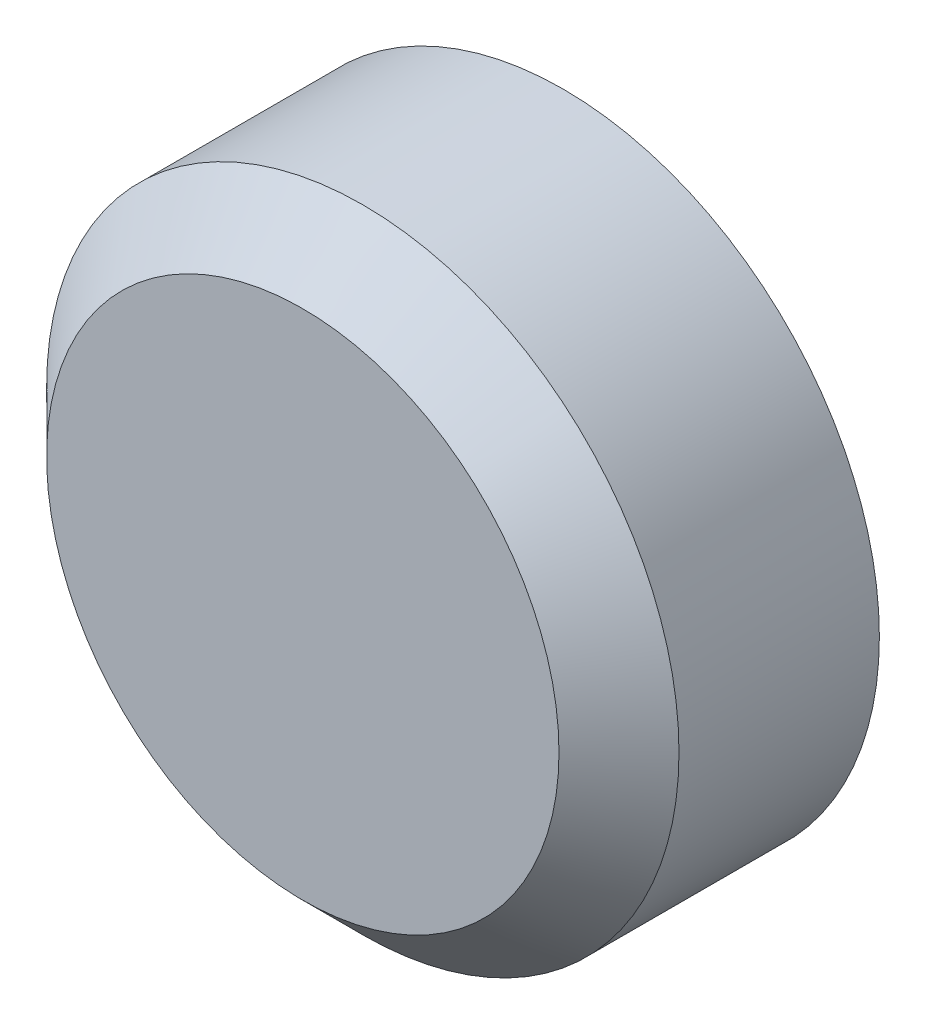
ISO-10303-21;
HEADER;
FILE_DESCRIPTION(('STEP AP214'),'2;1');
FILE_NAME('part.step','',(''),(''),'','','');
FILE_SCHEMA(('AUTOMOTIVE_DESIGN { 1 0 10303 214 1 1 1 1 }'));
ENDSEC;
DATA;
#1=APPLICATION_CONTEXT('core data for automotive mechanical design processes');
#2=APPLICATION_PROTOCOL_DEFINITION('international standard','automotive_design',2000,#1);
#3=PRODUCT_CONTEXT('',#1,'mechanical');
#4=PRODUCT('Part','Part','',(#3));
#5=PRODUCT_RELATED_PRODUCT_CATEGORY('part','',(#4));
#6=PRODUCT_DEFINITION_FORMATION('','',#4);
#7=PRODUCT_DEFINITION_CONTEXT('part definition',#1,'design');
#8=PRODUCT_DEFINITION('design','',#6,#7);
#9=PRODUCT_DEFINITION_SHAPE('','',#8);
#10=(LENGTH_UNIT() NAMED_UNIT(*) SI_UNIT(.MILLI.,.METRE.));
#11=(NAMED_UNIT(*) PLANE_ANGLE_UNIT() SI_UNIT($,.RADIAN.));
#12=(NAMED_UNIT(*) SI_UNIT($,.STERADIAN.) SOLID_ANGLE_UNIT());
#13=UNCERTAINTY_MEASURE_WITH_UNIT(LENGTH_MEASURE(1.E-05),#10,'distance_accuracy_value','');
#14=(GEOMETRIC_REPRESENTATION_CONTEXT(3) GLOBAL_UNCERTAINTY_ASSIGNED_CONTEXT((#13)) GLOBAL_UNIT_ASSIGNED_CONTEXT((#10,
#11,#12)) REPRESENTATION_CONTEXT('',''));
#15=CARTESIAN_POINT('',(0.,0.,0.));
#16=DIRECTION('',(0.,0.,1.));
#17=DIRECTION('',(1.,0.,0.));
#18=AXIS2_PLACEMENT_3D('',#15,#16,#17);
#19=CARTESIAN_POINT('',(0.,0.,9.62290547370621));
#20=DIRECTION('',(0.,0.,-1.));
#21=DIRECTION('',(-1.,0.,0.));
#22=AXIS2_PLACEMENT_3D('',#19,#20,#21);
#23=CYLINDRICAL_SURFACE('',#22,2.635);
#24=CARTESIAN_POINT('',(0.,0.,1.67));
#25=DIRECTION('',(0.,0.,1.));
#26=DIRECTION('',(1.,0.,0.));
#27=AXIS2_PLACEMENT_3D('',#24,#25,#26);
#28=CIRCLE('',#27,2.635);
#29=CARTESIAN_POINT('',(2.635,0.,1.67));
#30=VERTEX_POINT('',#29);
#31=EDGE_CURVE('E10',#30,#30,#28,.F.);
#32=ORIENTED_EDGE('',*,*,#31,.T.);
#33=EDGE_LOOP('',(#32));
#34=FACE_BOUND('',#33,.T.);
#35=CARTESIAN_POINT('',(0.,0.,0.));
#36=DIRECTION('',(0.,0.,1.));
#37=DIRECTION('',(1.,0.,0.));
#38=AXIS2_PLACEMENT_3D('',#35,#36,#37);
#39=CIRCLE('',#38,2.635);
#40=CARTESIAN_POINT('',(2.635,0.,0.));
#41=VERTEX_POINT('',#40);
#42=EDGE_CURVE('E41',#41,#41,#39,.T.);
#43=ORIENTED_EDGE('',*,*,#42,.T.);
#44=EDGE_LOOP('',(#43));
#45=FACE_BOUND('',#44,.T.);
#46=ADVANCED_FACE('F30',(#34,#45),#23,.T.);
#47=CARTESIAN_POINT('',(0.,0.,0.));
#48=DIRECTION('',(0.,0.,1.));
#49=DIRECTION('',(1.,0.,0.));
#50=AXIS2_PLACEMENT_3D('',#47,#48,#49);
#51=PLANE('',#50);
#52=ORIENTED_EDGE('',*,*,#42,.F.);
#53=EDGE_LOOP('',(#52));
#54=FACE_BOUND('',#53,.T.);
#55=ADVANCED_FACE('F49',(#54),#51,.F.);
#56=CARTESIAN_POINT('',(0.,0.,2.17));
#57=DIRECTION('',(0.,0.,1.));
#58=DIRECTION('',(0.,1.,0.));
#59=AXIS2_PLACEMENT_3D('',#56,#57,#58);
#60=PLANE('',#59);
#61=CARTESIAN_POINT('',(0.,0.,2.17));
#62=DIRECTION('',(0.,0.,1.));
#63=DIRECTION('',(1.,0.,0.));
#64=AXIS2_PLACEMENT_3D('',#61,#62,#63);
#65=CIRCLE('',#64,2.135);
#66=CARTESIAN_POINT('',(2.135,0.,2.17));
#67=VERTEX_POINT('',#66);
#68=EDGE_CURVE('E37',#67,#67,#65,.T.);
#69=ORIENTED_EDGE('',*,*,#68,.T.);
#70=EDGE_LOOP('',(#69));
#71=FACE_BOUND('',#70,.T.);
#72=ADVANCED_FACE('F51',(#71),#60,.T.);
#73=CARTESIAN_POINT('',(0.,0.,2.17));
#74=DIRECTION('',(0.,0.,-1.));
#75=DIRECTION('',(-1.,0.,0.));
#76=AXIS2_PLACEMENT_3D('',#73,#74,#75);
#77=CONICAL_SURFACE('',#76,2.135,0.785398163397449);
#78=ORIENTED_EDGE('',*,*,#31,.F.);
#79=EDGE_LOOP('',(#78));
#80=FACE_BOUND('',#79,.T.);
#81=ORIENTED_EDGE('',*,*,#68,.F.);
#82=EDGE_LOOP('',(#81));
#83=FACE_BOUND('',#82,.T.);
#84=ADVANCED_FACE('F32',(#80,#83),#77,.T.);
#85=CLOSED_SHELL('',(#46,#55,#72,#84));
#86=MANIFOLD_SOLID_BREP('B2',#85);
#87=ADVANCED_BREP_SHAPE_REPRESENTATION('',(#18,#86),#14);
#88=SHAPE_DEFINITION_REPRESENTATION(#9,#87);
ENDSEC;
END-ISO-10303-21;
